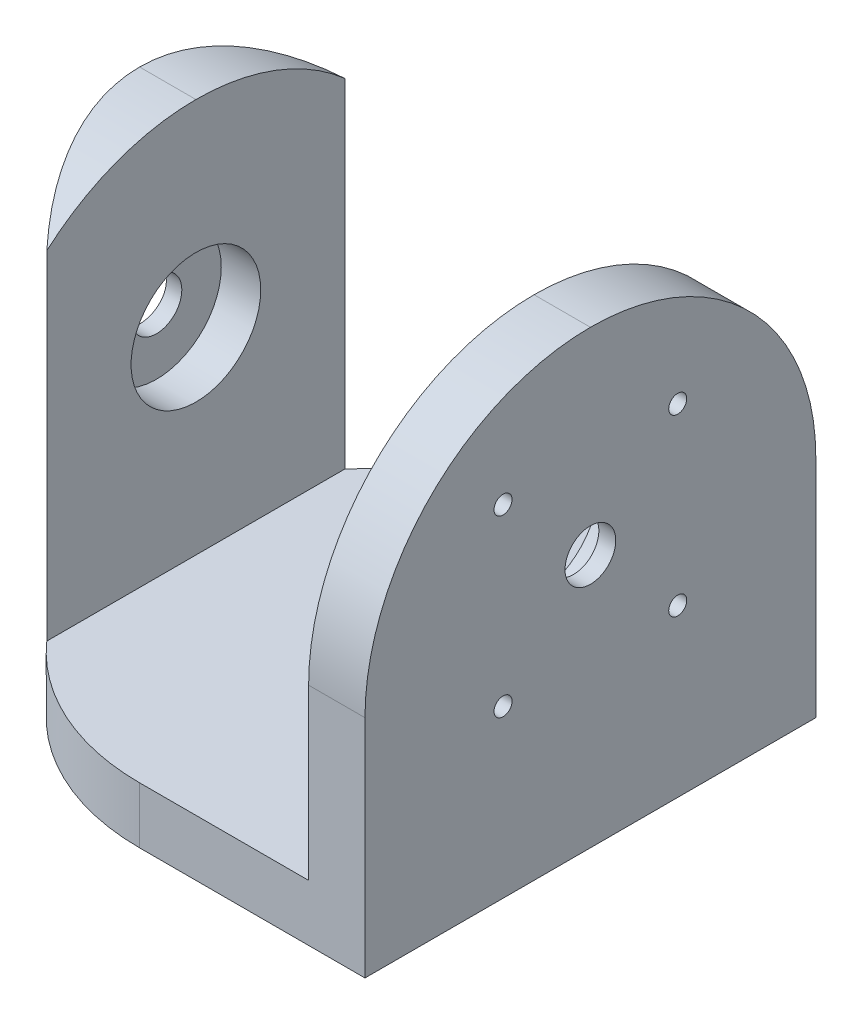
ISO-10303-21;
HEADER;
FILE_DESCRIPTION(('STEP AP214'),'2;1');
FILE_NAME('part.step','',(''),(''),'','','');
FILE_SCHEMA(('AUTOMOTIVE_DESIGN { 1 0 10303 214 1 1 1 1 }'));
ENDSEC;
DATA;
#1=APPLICATION_CONTEXT('core data for automotive mechanical design processes');
#2=APPLICATION_PROTOCOL_DEFINITION('international standard','automotive_design',2000,#1);
#3=PRODUCT_CONTEXT('',#1,'mechanical');
#4=PRODUCT('Part','Part','',(#3));
#5=PRODUCT_RELATED_PRODUCT_CATEGORY('part','',(#4));
#6=PRODUCT_DEFINITION_FORMATION('','',#4);
#7=PRODUCT_DEFINITION_CONTEXT('part definition',#1,'design');
#8=PRODUCT_DEFINITION('design','',#6,#7);
#9=PRODUCT_DEFINITION_SHAPE('','',#8);
#10=(LENGTH_UNIT() NAMED_UNIT(*) SI_UNIT(.MILLI.,.METRE.));
#11=(NAMED_UNIT(*) PLANE_ANGLE_UNIT() SI_UNIT($,.RADIAN.));
#12=(NAMED_UNIT(*) SI_UNIT($,.STERADIAN.) SOLID_ANGLE_UNIT());
#13=UNCERTAINTY_MEASURE_WITH_UNIT(LENGTH_MEASURE(1.E-05),#10,'distance_accuracy_value','');
#14=(GEOMETRIC_REPRESENTATION_CONTEXT(3) GLOBAL_UNCERTAINTY_ASSIGNED_CONTEXT((#13)) GLOBAL_UNIT_ASSIGNED_CONTEXT((#10,
#11,#12)) REPRESENTATION_CONTEXT('',''));
#15=CARTESIAN_POINT('',(0.,0.,0.));
#16=DIRECTION('',(0.,0.,1.));
#17=DIRECTION('',(1.,0.,0.));
#18=AXIS2_PLACEMENT_3D('',#15,#16,#17);
#19=CARTESIAN_POINT('',(0.,10.,0.));
#20=DIRECTION('',(0.,-1.,0.));
#21=DIRECTION('',(0.,0.,-1.));
#22=AXIS2_PLACEMENT_3D('',#19,#20,#21);
#23=PLANE('',#22);
#24=DIRECTION('',(-1.,0.,0.));
#25=VECTOR('',#24,1.);
#26=CARTESIAN_POINT('',(0.,10.,1.75));
#27=LINE('',#26,#25);
#28=CARTESIAN_POINT('',(2.28103594886183,10.,1.75));
#29=VERTEX_POINT('',#28);
#30=CARTESIAN_POINT('',(-2.28103594886183,10.,1.75));
#31=VERTEX_POINT('',#30);
#32=EDGE_CURVE('E361',#29,#31,#27,.T.);
#33=ORIENTED_EDGE('',*,*,#32,.T.);
#34=CARTESIAN_POINT('',(0.,10.,0.));
#35=DIRECTION('',(0.,1.,0.));
#36=DIRECTION('',(0.,0.,1.));
#37=AXIS2_PLACEMENT_3D('',#34,#35,#36);
#38=CIRCLE('',#37,2.875);
#39=EDGE_CURVE('E364',#29,#31,#38,.T.);
#40=ORIENTED_EDGE('',*,*,#39,.F.);
#41=EDGE_LOOP('',(#33,#40));
#42=FACE_BOUND('',#41,.T.);
#43=CARTESIAN_POINT('',(0.,9.99999999999999,0.));
#44=DIRECTION('',(0.,-1.,0.));
#45=DIRECTION('',(0.,0.,-1.));
#46=AXIS2_PLACEMENT_3D('',#43,#44,#45);
#47=CIRCLE('',#46,40.);
#48=CARTESIAN_POINT('',(-30.,9.99999999999999,-26.457513110646));
#49=VERTEX_POINT('',#48);
#50=CARTESIAN_POINT('',(0.,9.99999999999999,-40.));
#51=VERTEX_POINT('',#50);
#52=EDGE_CURVE('E312',#49,#51,#47,.T.);
#53=ORIENTED_EDGE('',*,*,#52,.F.);
#54=DIRECTION('',(0.,0.,1.));
#55=VECTOR('',#54,1.);
#56=CARTESIAN_POINT('',(-30.,10.,-40.));
#57=LINE('',#56,#55);
#58=CARTESIAN_POINT('',(-30.,9.99999999999999,26.4575131106459));
#59=VERTEX_POINT('',#58);
#60=EDGE_CURVE('E372',#49,#59,#57,.T.);
#61=ORIENTED_EDGE('',*,*,#60,.T.);
#62=CARTESIAN_POINT('',(0.,9.99999999999999,0.));
#63=DIRECTION('',(0.,-1.,0.));
#64=DIRECTION('',(0.,0.,-1.));
#65=AXIS2_PLACEMENT_3D('',#62,#63,#64);
#66=CIRCLE('',#65,40.);
#67=CARTESIAN_POINT('',(0.,9.99999999999999,40.));
#68=VERTEX_POINT('',#67);
#69=EDGE_CURVE('E332',#68,#59,#66,.T.);
#70=ORIENTED_EDGE('',*,*,#69,.F.);
#71=DIRECTION('',(1.,0.,0.));
#72=VECTOR('',#71,1.);
#73=CARTESIAN_POINT('',(-40.,10.,40.));
#74=LINE('',#73,#72);
#75=CARTESIAN_POINT('',(30.,10.,40.));
#76=VERTEX_POINT('',#75);
#77=EDGE_CURVE('E264',#68,#76,#74,.T.);
#78=ORIENTED_EDGE('',*,*,#77,.T.);
#79=DIRECTION('',(0.,0.,1.));
#80=VECTOR('',#79,1.);
#81=CARTESIAN_POINT('',(30.,10.,-40.));
#82=LINE('',#81,#80);
#83=CARTESIAN_POINT('',(30.,10.,-40.));
#84=VERTEX_POINT('',#83);
#85=EDGE_CURVE('E286',#84,#76,#82,.T.);
#86=ORIENTED_EDGE('',*,*,#85,.F.);
#87=DIRECTION('',(-1.,0.,0.));
#88=VECTOR('',#87,1.);
#89=CARTESIAN_POINT('',(-40.,10.,-40.));
#90=LINE('',#89,#88);
#91=EDGE_CURVE('E292',#84,#51,#90,.T.);
#92=ORIENTED_EDGE('',*,*,#91,.T.);
#93=EDGE_LOOP('',(#53,#61,#70,#78,#86,#92));
#94=FACE_BOUND('',#93,.T.);
#95=ADVANCED_FACE('F41',(#42,#94),#23,.F.);
#96=CARTESIAN_POINT('',(0.,0.,0.));
#97=DIRECTION('',(0.,-1.,0.));
#98=DIRECTION('',(0.,0.,-1.));
#99=AXIS2_PLACEMENT_3D('',#96,#97,#98);
#100=PLANE('',#99);
#101=CARTESIAN_POINT('',(0.,0.,0.));
#102=DIRECTION('',(0.,-1.,0.));
#103=DIRECTION('',(0.,0.,-1.));
#104=AXIS2_PLACEMENT_3D('',#101,#102,#103);
#105=CIRCLE('',#104,3.625);
#106=CARTESIAN_POINT('',(0.,0.,-3.625));
#107=VERTEX_POINT('',#106);
#108=EDGE_CURVE('E343',#107,#107,#105,.T.);
#109=ORIENTED_EDGE('',*,*,#108,.F.);
#110=EDGE_LOOP('',(#109));
#111=FACE_BOUND('',#110,.T.);
#112=CARTESIAN_POINT('',(0.,0.,0.));
#113=DIRECTION('',(0.,-1.,0.));
#114=DIRECTION('',(0.,0.,-1.));
#115=AXIS2_PLACEMENT_3D('',#112,#113,#114);
#116=CIRCLE('',#115,40.);
#117=CARTESIAN_POINT('',(0.,0.,40.));
#118=VERTEX_POINT('',#117);
#119=CARTESIAN_POINT('',(0.,0.,-40.));
#120=VERTEX_POINT('',#119);
#121=EDGE_CURVE('E310',#118,#120,#116,.T.);
#122=ORIENTED_EDGE('',*,*,#121,.T.);
#123=DIRECTION('',(-1.,0.,0.));
#124=VECTOR('',#123,1.);
#125=CARTESIAN_POINT('',(-40.,0.,-40.));
#126=LINE('',#125,#124);
#127=CARTESIAN_POINT('',(40.,0.,-40.));
#128=VERTEX_POINT('',#127);
#129=EDGE_CURVE('E303',#128,#120,#126,.T.);
#130=ORIENTED_EDGE('',*,*,#129,.F.);
#131=DIRECTION('',(0.,0.,-1.));
#132=VECTOR('',#131,1.);
#133=CARTESIAN_POINT('',(40.,0.,40.));
#134=LINE('',#133,#132);
#135=CARTESIAN_POINT('',(40.,0.,40.));
#136=VERTEX_POINT('',#135);
#137=EDGE_CURVE('E256',#136,#128,#134,.T.);
#138=ORIENTED_EDGE('',*,*,#137,.F.);
#139=DIRECTION('',(1.,0.,0.));
#140=VECTOR('',#139,1.);
#141=CARTESIAN_POINT('',(-40.,0.,40.));
#142=LINE('',#141,#140);
#143=EDGE_CURVE('E283',#118,#136,#142,.T.);
#144=ORIENTED_EDGE('',*,*,#143,.F.);
#145=EDGE_LOOP('',(#122,#130,#138,#144));
#146=FACE_BOUND('',#145,.T.);
#147=ADVANCED_FACE('F194',(#111,#146),#100,.T.);
#148=CARTESIAN_POINT('',(-30.,80.,-40.));
#149=DIRECTION('',(1.,0.,0.));
#150=DIRECTION('',(0.,0.,-1.));
#151=AXIS2_PLACEMENT_3D('',#148,#149,#150);
#152=PLANE('',#151);
#153=CARTESIAN_POINT('',(-30.,45.,0.));
#154=DIRECTION('',(1.,0.,0.));
#155=DIRECTION('',(0.,0.,-1.));
#156=AXIS2_PLACEMENT_3D('',#153,#154,#155);
#157=CIRCLE('',#156,11.5);
#158=CARTESIAN_POINT('',(-30.,45.,-11.5));
#159=VERTEX_POINT('',#158);
#160=EDGE_CURVE('E155',#159,#159,#157,.T.);
#161=ORIENTED_EDGE('',*,*,#160,.F.);
#162=EDGE_LOOP('',(#161));
#163=FACE_BOUND('',#162,.T.);
#164=ORIENTED_EDGE('',*,*,#60,.F.);
#165=DIRECTION('',(0.,-1.,0.));
#166=VECTOR('',#165,1.);
#167=CARTESIAN_POINT('',(-30.,80.,-26.457513110646));
#168=LINE('',#167,#166);
#169=CARTESIAN_POINT('',(-30.,70.,-26.4575131106459));
#170=VERTEX_POINT('',#169);
#171=EDGE_CURVE('E315',#49,#170,#168,.F.);
#172=ORIENTED_EDGE('',*,*,#171,.T.);
#173=CARTESIAN_POINT('',(-30.,40.,0.));
#174=DIRECTION('',(1.,0.,0.));
#175=DIRECTION('',(0.,0.,-1.));
#176=AXIS2_PLACEMENT_3D('',#173,#174,#175);
#177=CIRCLE('',#176,40.);
#178=CARTESIAN_POINT('',(-30.,80.,0.));
#179=VERTEX_POINT('',#178);
#180=EDGE_CURVE('E136',#170,#179,#177,.T.);
#181=ORIENTED_EDGE('',*,*,#180,.T.);
#182=CARTESIAN_POINT('',(-30.,40.,0.));
#183=DIRECTION('',(1.,0.,0.));
#184=DIRECTION('',(0.,0.,-1.));
#185=AXIS2_PLACEMENT_3D('',#182,#183,#184);
#186=CIRCLE('',#185,40.);
#187=CARTESIAN_POINT('',(-30.,70.,26.4575131106459));
#188=VERTEX_POINT('',#187);
#189=EDGE_CURVE('E153',#179,#188,#186,.T.);
#190=ORIENTED_EDGE('',*,*,#189,.T.);
#191=DIRECTION('',(0.,-1.,0.));
#192=VECTOR('',#191,1.);
#193=CARTESIAN_POINT('',(-30.,80.,26.4575131106459));
#194=LINE('',#193,#192);
#195=EDGE_CURVE('E146',#188,#59,#194,.T.);
#196=ORIENTED_EDGE('',*,*,#195,.T.);
#197=EDGE_LOOP('',(#164,#172,#181,#190,#196));
#198=FACE_BOUND('',#197,.T.);
#199=ADVANCED_FACE('F200',(#163,#198),#152,.T.);
#200=CARTESIAN_POINT('',(-37.,45.,0.));
#201=DIRECTION('',(-1.,0.,0.));
#202=DIRECTION('',(0.,0.,1.));
#203=AXIS2_PLACEMENT_3D('',#200,#201,#202);
#204=CYLINDRICAL_SURFACE('',#203,4.5);
#205=CARTESIAN_POINT('',(-37.,45.,0.));
#206=DIRECTION('',(1.,0.,0.));
#207=DIRECTION('',(0.,0.,-1.));
#208=AXIS2_PLACEMENT_3D('',#205,#206,#207);
#209=CIRCLE('',#208,4.5);
#210=CARTESIAN_POINT('',(-37.,45.,-4.5));
#211=VERTEX_POINT('',#210);
#212=EDGE_CURVE('E335',#211,#211,#209,.T.);
#213=ORIENTED_EDGE('',*,*,#212,.T.);
#214=EDGE_LOOP('',(#213));
#215=FACE_BOUND('',#214,.T.);
#216=CARTESIAN_POINT('',(-40.,40.5,0.));
#217=CARTESIAN_POINT('',(-39.9999998016922,40.5000006733647,0.125897794169932));
#218=CARTESIAN_POINT('',(-39.9994040479666,40.5052878583755,0.251816081917568));
#219=CARTESIAN_POINT('',(-39.997036799132,40.5264041517945,0.5028042246572));
#220=CARTESIAN_POINT('',(-39.995264739511,40.5422383217391,0.627873643147814));
#221=CARTESIAN_POINT('',(-39.9905906481609,40.5843710030467,0.876432829397886));
#222=CARTESIAN_POINT('',(-39.9876867415808,40.6106868784523,0.999919623230281));
#223=CARTESIAN_POINT('',(-39.9808298018973,40.6736009783238,1.24426437975462));
#224=CARTESIAN_POINT('',(-39.9768763726216,40.7102030859278,1.36512133105895));
#225=CARTESIAN_POINT('',(-39.9680387383215,40.7933593015609,1.60313538429751));
#226=CARTESIAN_POINT('',(-39.9631558476638,40.8398993673445,1.72029744174492));
#227=CARTESIAN_POINT('',(-39.9525909172002,40.9426447620923,1.95031817659451));
#228=CARTESIAN_POINT('',(-39.9469085828619,40.9988536549689,2.06317524837942));
#229=CARTESIAN_POINT('',(-39.9349103713499,41.1204738204987,2.28366274850285));
#230=CARTESIAN_POINT('',(-39.9285950056627,41.1858776805917,2.39129729390047));
#231=CARTESIAN_POINT('',(-39.9155011432103,41.325484938078,2.60072736280874));
#232=CARTESIAN_POINT('',(-39.9087224756033,41.3996915889862,2.70252070665515));
#233=CARTESIAN_POINT('',(-39.8948677682332,41.5566576619524,2.89988809192034));
#234=CARTESIAN_POINT('',(-39.8877907110016,41.6394480370957,2.99543744607898));
#235=CARTESIAN_POINT('',(-39.8735598649228,41.8128007692536,3.17926532476615));
#236=CARTESIAN_POINT('',(-39.8664060486691,41.9033659889012,3.26754114759346));
#237=CARTESIAN_POINT('',(-39.8522281504109,42.0915829299084,3.43614153534427));
#238=CARTESIAN_POINT('',(-39.8452040338624,42.1892327291964,3.51646824301364));
#239=CARTESIAN_POINT('',(-39.8314796721273,42.3909954690487,3.66866040017973));
#240=CARTESIAN_POINT('',(-39.8247795474037,42.4951107811752,3.74052271658939));
#241=CARTESIAN_POINT('',(-39.8118812330373,42.7092932908895,3.87539874952149));
#242=CARTESIAN_POINT('',(-39.8056842460055,42.8193737575812,3.93839151503679));
#243=CARTESIAN_POINT('',(-39.7939848415169,43.0445267701195,4.05489824320788));
#244=CARTESIAN_POINT('',(-39.7884826825745,43.1596011527077,4.10840868088398));
#245=CARTESIAN_POINT('',(-39.7783363482945,43.3938512076461,4.20551394183275));
#246=CARTESIAN_POINT('',(-39.773691825973,43.5130251981181,4.2491127768143));
#247=CARTESIAN_POINT('',(-39.765389602351,43.7546727516294,4.3261146559858));
#248=CARTESIAN_POINT('',(-39.7617322689817,43.8771475262375,4.35951389933416));
#249=CARTESIAN_POINT('',(-39.7524421143434,44.2470529143269,4.44372607448188));
#250=CARTESIAN_POINT('',(-39.7484346980064,44.4982284798943,4.4790755474873));
#251=CARTESIAN_POINT('',(-39.7452681870008,45.0029747377956,4.5070916983492));
#252=CARTESIAN_POINT('',(-39.7461089415873,45.256545355415,4.49975970330635));
#253=CARTESIAN_POINT('',(-39.7509021396873,45.6324515075959,4.45711639306198));
#254=CARTESIAN_POINT('',(-39.7530815508767,45.7567945774525,4.43769026744366));
#255=CARTESIAN_POINT('',(-39.758541588758,46.0033799405732,4.38850855674904));
#256=CARTESIAN_POINT('',(-39.7618218034796,46.1256230017909,4.35875683583387));
#257=CARTESIAN_POINT('',(-39.7693932267524,46.367199519133,4.28912359161516));
#258=CARTESIAN_POINT('',(-39.7736848277801,46.4865318258281,4.24923813536442));
#259=CARTESIAN_POINT('',(-39.783154101944,46.7213678752207,4.15964880119058));
#260=CARTESIAN_POINT('',(-39.788331453898,46.8368729876386,4.10994848123141));
#261=CARTESIAN_POINT('',(-39.7994416250633,47.0635915711467,4.00093163997066));
#262=CARTESIAN_POINT('',(-39.8053764094869,47.1747928610676,3.94158999012488));
#263=CARTESIAN_POINT('',(-39.8178202640958,47.3917647613468,3.81383079042048));
#264=CARTESIAN_POINT('',(-39.8243291253585,47.497537325381,3.74541653780618));
#265=CARTESIAN_POINT('',(-39.8377416223662,47.7029930052001,3.59995508535281));
#266=CARTESIAN_POINT('',(-39.8446453816279,47.8026741953291,3.52290517713157));
#267=CARTESIAN_POINT('',(-39.8586492001324,47.9951846495661,3.36075902274504));
#268=CARTESIAN_POINT('',(-39.8657491872425,48.0880163866485,3.27566570619095));
#269=CARTESIAN_POINT('',(-39.8799900295372,48.2667395897394,3.09748712474335));
#270=CARTESIAN_POINT('',(-39.8871308839011,48.3525878709552,3.00435853662628));
#271=CARTESIAN_POINT('',(-39.9012077856988,48.516108341074,2.81122504105011));
#272=CARTESIAN_POINT('',(-39.9081439071697,48.5937835123227,2.71122266399387));
#273=CARTESIAN_POINT('',(-39.9216237223485,48.7405058049993,2.50492536120184));
#274=CARTESIAN_POINT('',(-39.9281670838737,48.809545675015,2.39862525592465));
#275=CARTESIAN_POINT('',(-39.9406674482757,48.9384043456287,2.18059634604119));
#276=CARTESIAN_POINT('',(-39.9466246692907,48.9982265813938,2.0688695843211));
#277=CARTESIAN_POINT('',(-39.9577948244914,49.1083296942292,1.84057351974979));
#278=CARTESIAN_POINT('',(-39.9630066685784,49.1585966315048,1.72399743986509));
#279=CARTESIAN_POINT('',(-39.9725255898458,49.2490973113226,1.48702771834148));
#280=CARTESIAN_POINT('',(-39.9768330112379,49.289334872012,1.36663554920902));
#281=CARTESIAN_POINT('',(-39.9844163789569,49.3594456186983,1.12306243727675));
#282=CARTESIAN_POINT('',(-39.9876940604375,49.3893362484458,0.999886564756));
#283=CARTESIAN_POINT('',(-39.9931331545323,49.4386149287772,0.751478051908749));
#284=CARTESIAN_POINT('',(-39.9952951105742,49.4580080925054,0.626246443580106));
#285=CARTESIAN_POINT('',(-39.9979088348612,49.4813826283866,0.417372166218101));
#286=CARTESIAN_POINT('',(-39.9986920958534,49.4883617060622,0.334057162753994));
#287=CARTESIAN_POINT('',(-39.999737744327,49.4976706160565,0.167164450744655));
#288=CARTESIAN_POINT('',(-40.0000001316616,49.5000004470639,0.0835867421253376));
#289=CARTESIAN_POINT('',(-39.9999998016922,49.4999993266353,-0.125897794169917));
#290=CARTESIAN_POINT('',(-39.9994040479666,49.4947121416245,-0.251816081917552));
#291=CARTESIAN_POINT('',(-39.997036799132,49.4735958482055,-0.502804224657184));
#292=CARTESIAN_POINT('',(-39.995264739511,49.4577616782609,-0.627873643147799));
#293=CARTESIAN_POINT('',(-39.9905906481609,49.4156289969533,-0.87643282939787));
#294=CARTESIAN_POINT('',(-39.9876867415808,49.3893131215477,-0.999919623230264));
#295=CARTESIAN_POINT('',(-39.9808298018973,49.3263990216762,-1.2442643797546));
#296=CARTESIAN_POINT('',(-39.9768763726216,49.2897969140722,-1.36512133105894));
#297=CARTESIAN_POINT('',(-39.9680387383215,49.2066406984391,-1.60313538429749));
#298=CARTESIAN_POINT('',(-39.9631558476638,49.1601006326555,-1.7202974417449));
#299=CARTESIAN_POINT('',(-39.9525909172002,49.0573552379077,-1.9503181765945));
#300=CARTESIAN_POINT('',(-39.9469085828619,49.0011463450312,-2.06317524837941));
#301=CARTESIAN_POINT('',(-39.9349103713499,48.8795261795014,-2.28366274850284));
#302=CARTESIAN_POINT('',(-39.9285950056627,48.8141223194083,-2.39129729390046));
#303=CARTESIAN_POINT('',(-39.9155011432103,48.674515061922,-2.60072736280872));
#304=CARTESIAN_POINT('',(-39.9087224756033,48.6003084110138,-2.70252070665513));
#305=CARTESIAN_POINT('',(-39.8948677682332,48.4433423380476,-2.89988809192033));
#306=CARTESIAN_POINT('',(-39.8877907110016,48.3605519629043,-2.99543744607897));
#307=CARTESIAN_POINT('',(-39.8735598649228,48.1871992307465,-3.17926532476614));
#308=CARTESIAN_POINT('',(-39.8664060486691,48.0966340110988,-3.26754114759345));
#309=CARTESIAN_POINT('',(-39.8522281504109,47.9084170700916,-3.43614153534426));
#310=CARTESIAN_POINT('',(-39.8452040338624,47.8107672708036,-3.51646824301363));
#311=CARTESIAN_POINT('',(-39.8314796721273,47.6090045309513,-3.66866040017973));
#312=CARTESIAN_POINT('',(-39.8247795474037,47.5048892188248,-3.74052271658938));
#313=CARTESIAN_POINT('',(-39.8118812330373,47.2907067091105,-3.87539874952148));
#314=CARTESIAN_POINT('',(-39.8056842460055,47.1806262424189,-3.93839151503678));
#315=CARTESIAN_POINT('',(-39.7939848415169,46.9554732298805,-4.05489824320787));
#316=CARTESIAN_POINT('',(-39.7884826825745,46.8403988472923,-4.10840868088398));
#317=CARTESIAN_POINT('',(-39.7783363482945,46.6061487923539,-4.20551394183274));
#318=CARTESIAN_POINT('',(-39.773691825973,46.4869748018819,-4.2491127768143));
#319=CARTESIAN_POINT('',(-39.765389602351,46.2453272483707,-4.3261146559858));
#320=CARTESIAN_POINT('',(-39.7617322689817,46.1228524737625,-4.35951389933416));
#321=CARTESIAN_POINT('',(-39.7524421143434,45.7529470856731,-4.44372607448188));
#322=CARTESIAN_POINT('',(-39.7484346980064,45.5017715201057,-4.4790755474873));
#323=CARTESIAN_POINT('',(-39.7452681870008,44.9970252622045,-4.5070916983492));
#324=CARTESIAN_POINT('',(-39.7461089415873,44.743454644585,-4.49975970330635));
#325=CARTESIAN_POINT('',(-39.7509021396873,44.3675484924041,-4.45711639306199));
#326=CARTESIAN_POINT('',(-39.7530815508767,44.2432054225476,-4.43769026744367));
#327=CARTESIAN_POINT('',(-39.758541588758,43.9966200594269,-4.38850855674904));
#328=CARTESIAN_POINT('',(-39.7618218034796,43.8743769982091,-4.35875683583388));
#329=CARTESIAN_POINT('',(-39.7693932267524,43.632800480867,-4.28912359161517));
#330=CARTESIAN_POINT('',(-39.7736848277801,43.5134681741719,-4.24923813536443));
#331=CARTESIAN_POINT('',(-39.783154101944,43.2786321247793,-4.1596488011906));
#332=CARTESIAN_POINT('',(-39.788331453898,43.1631270123615,-4.10994848123143));
#333=CARTESIAN_POINT('',(-39.7994416250633,42.9364084288534,-4.00093163997067));
#334=CARTESIAN_POINT('',(-39.8053764094869,42.8252071389324,-3.94158999012489));
#335=CARTESIAN_POINT('',(-39.8178202640958,42.6082352386532,-3.8138307904205));
#336=CARTESIAN_POINT('',(-39.8243291253585,42.502462674619,-3.7454165378062));
#337=CARTESIAN_POINT('',(-39.8377416223662,42.2970069947999,-3.59995508535283));
#338=CARTESIAN_POINT('',(-39.8446453816279,42.1973258046709,-3.52290517713159));
#339=CARTESIAN_POINT('',(-39.8586492001324,42.0048153504339,-3.36075902274505));
#340=CARTESIAN_POINT('',(-39.8657491872425,41.9119836133515,-3.27566570619097));
#341=CARTESIAN_POINT('',(-39.8799900295372,41.7332604102607,-3.09748712474337));
#342=CARTESIAN_POINT('',(-39.8871308839011,41.6474121290448,-3.0043585366263));
#343=CARTESIAN_POINT('',(-39.9012077856988,41.4838916589261,-2.81122504105013));
#344=CARTESIAN_POINT('',(-39.9081439071697,41.4062164876773,-2.71122266399389));
#345=CARTESIAN_POINT('',(-39.9216237223485,41.2594941950007,-2.50492536120186));
#346=CARTESIAN_POINT('',(-39.9281670838737,41.190454324985,-2.39862525592467));
#347=CARTESIAN_POINT('',(-39.9406674482757,41.0615956543713,-2.18059634604121));
#348=CARTESIAN_POINT('',(-39.9466246692907,41.0017734186062,-2.06886958432112));
#349=CARTESIAN_POINT('',(-39.9577948244914,40.8916703057708,-1.84057351974982));
#350=CARTESIAN_POINT('',(-39.9630066685784,40.8414033684952,-1.72399743986511));
#351=CARTESIAN_POINT('',(-39.9725255898458,40.7509026886774,-1.4870277183415));
#352=CARTESIAN_POINT('',(-39.9768330112379,40.710665127988,-1.36663554920905));
#353=CARTESIAN_POINT('',(-39.9844163789569,40.6405543813017,-1.12306243727678));
#354=CARTESIAN_POINT('',(-39.9876940604375,40.6106637515542,-0.999886564756024));
#355=CARTESIAN_POINT('',(-39.9931331545323,40.5613850712228,-0.751478051908773));
#356=CARTESIAN_POINT('',(-39.9952951105742,40.5419919074946,-0.626246443580131));
#357=CARTESIAN_POINT('',(-39.9979088348612,40.5186173716134,-0.417372166218122));
#358=CARTESIAN_POINT('',(-39.9986920958534,40.5116382939378,-0.334057162754008));
#359=CARTESIAN_POINT('',(-39.999737744327,40.5023293839435,-0.167164450744654));
#360=CARTESIAN_POINT('',(-40.0000001316616,40.4999995529361,-0.0835867421253299));
#361=CARTESIAN_POINT('',(-40.,40.5,0.));
#362=B_SPLINE_CURVE_WITH_KNOTS('',3,(#216,#217,#218,#219,#220,#221,#222,#223,#224,#225,#226,
#227,#228,#229,#230,#231,#232,#233,#234,#235,#236,#237,#238,#239,#240,#241,#242,#243,#244,#245,
#246,#247,#248,#249,#250,#251,#252,#253,#254,#255,#256,#257,#258,#259,#260,#261,#262,#263,#264,
#265,#266,#267,#268,#269,#270,#271,#272,#273,#274,#275,#276,#277,#278,#279,#280,#281,#282,#283,
#284,#285,#286,#287,#288,#289,#290,#291,#292,#293,#294,#295,#296,#297,#298,#299,#300,#301,#302,
#303,#304,#305,#306,#307,#308,#309,#310,#311,#312,#313,#314,#315,#316,#317,#318,#319,#320,#321,
#322,#323,#324,#325,#326,#327,#328,#329,#330,#331,#332,#333,#334,#335,#336,#337,#338,#339,#340,
#341,#342,#343,#344,#345,#346,#347,#348,#349,#350,#351,#352,#353,#354,#355,#356,#357,#358,#359,
#360,#361),.UNSPECIFIED.,.T.,.F.,(4,2,2,2,2,2,2,2,2,2,2,2,2,2,2,2,2,2,2,2,2,2,2,2,2,2,2,2,2,2,2,
2,2,2,2,2,2,2,2,2,2,2,2,2,2,2,2,2,2,2,2,2,2,2,2,2,2,2,2,2,2,2,2,2,2,2,2,2,2,2,2,2,4),(0.,
0.37761673646876,0.755414823277612,1.13384139271567,1.51241101367371,1.89044921753152,
2.26862706535891,2.64650177336073,3.02451658172423,3.40394534007983,3.78351440508457,
4.16298087398963,4.54258736359209,4.92307600635537,5.30370579736136,5.68418125355195,
6.06479832004327,6.8219793799544,7.57913689685791,7.95637534198589,8.33347276463008,
8.71071676459905,9.08782426090975,9.46593087561174,9.8439004501884,10.2219889000304,
10.599940167334,10.98007451503,11.3600696681502,11.7403818062749,12.120551867583,
12.5012723555682,12.881847682512,13.2617782416617,13.6415235759312,13.8922328443466,
14.1429421834699,14.5205589199387,14.8983570067475,15.2767835761856,15.6553531971436,
16.0333914010014,16.4115692488288,16.7894439568306,17.1674587651941,17.5468875235497,
17.9264565885545,18.3059230574595,18.685529547062,19.0660181898253,19.4466479808313,
19.8271234370218,20.2077405035132,20.9649215634243,21.7220790803278,22.0993175254558,
22.4764149481,22.853658948069,23.2307664443797,23.6088730590816,23.9868426336583,
24.3649310835003,24.7428823508039,25.1230166984998,25.5030118516201,25.8833239897448,
26.2634940510529,26.6442145390381,27.0247898659819,27.4047204251317,27.7844657594011,
28.0351750278165,28.2858843669399),.UNSPECIFIED.);
#363=CARTESIAN_POINT('',(-40.,40.5,0.));
#364=VERTEX_POINT('',#363);
#365=EDGE_CURVE('E50',#364,#364,#362,.T.);
#366=ORIENTED_EDGE('',*,*,#365,.T.);
#367=EDGE_LOOP('',(#366));
#368=FACE_BOUND('',#367,.T.);
#369=ADVANCED_FACE('F175',(#215,#368),#204,.F.);
#370=CARTESIAN_POINT('',(-40.,10.,-40.));
#371=DIRECTION('',(0.,0.,1.));
#372=DIRECTION('',(1.,0.,0.));
#373=AXIS2_PLACEMENT_3D('',#370,#371,#372);
#374=PLANE('',#373);
#375=DIRECTION('',(0.,-1.,0.));
#376=VECTOR('',#375,1.);
#377=CARTESIAN_POINT('',(0.,80.,-40.));
#378=LINE('',#377,#376);
#379=EDGE_CURVE('E297',#51,#120,#378,.T.);
#380=ORIENTED_EDGE('',*,*,#379,.F.);
#381=ORIENTED_EDGE('',*,*,#91,.F.);
#382=DIRECTION('',(0.,-1.,0.));
#383=VECTOR('',#382,1.);
#384=CARTESIAN_POINT('',(30.,80.,-40.));
#385=LINE('',#384,#383);
#386=CARTESIAN_POINT('',(30.,40.,-40.));
#387=VERTEX_POINT('',#386);
#388=EDGE_CURVE('E249',#387,#84,#385,.T.);
#389=ORIENTED_EDGE('',*,*,#388,.F.);
#390=DIRECTION('',(-1.,0.,0.));
#391=VECTOR('',#390,1.);
#392=CARTESIAN_POINT('',(-40.,40.,-40.));
#393=LINE('',#392,#391);
#394=CARTESIAN_POINT('',(40.,40.,-40.));
#395=VERTEX_POINT('',#394);
#396=EDGE_CURVE('E240',#387,#395,#393,.F.);
#397=ORIENTED_EDGE('',*,*,#396,.T.);
#398=DIRECTION('',(0.,-1.,0.));
#399=VECTOR('',#398,1.);
#400=CARTESIAN_POINT('',(40.,10.,-40.));
#401=LINE('',#400,#399);
#402=EDGE_CURVE('E246',#395,#128,#401,.T.);
#403=ORIENTED_EDGE('',*,*,#402,.T.);
#404=ORIENTED_EDGE('',*,*,#129,.T.);
#405=EDGE_LOOP('',(#380,#381,#389,#397,#403,#404));
#406=FACE_BOUND('',#405,.T.);
#407=ADVANCED_FACE('F214',(#406),#374,.F.);
#408=CARTESIAN_POINT('',(-40.,40.,0.));
#409=DIRECTION('',(1.,0.,0.));
#410=DIRECTION('',(0.,0.,-1.));
#411=AXIS2_PLACEMENT_3D('',#408,#409,#410);
#412=CYLINDRICAL_SURFACE('',#411,40.);
#413=ORIENTED_EDGE('',*,*,#180,.F.);
#414=CARTESIAN_POINT('',(0.,40.,0.));
#415=DIRECTION('',(0.707106781186547,0.707106781186547,0.));
#416=DIRECTION('',(0.707106781186547,-0.707106781186547,0.));
#417=AXIS2_PLACEMENT_3D('',#414,#415,#416);
#418=ELLIPSE('',#417,56.5685424949238,40.);
#419=CARTESIAN_POINT('',(-40.,80.,0.));
#420=VERTEX_POINT('',#419);
#421=EDGE_CURVE('E11',#170,#420,#418,.T.);
#422=ORIENTED_EDGE('',*,*,#421,.T.);
#423=DIRECTION('',(1.,0.,0.));
#424=VECTOR('',#423,1.);
#425=CARTESIAN_POINT('',(0.,80.,0.));
#426=LINE('',#425,#424);
#427=EDGE_CURVE('E134',#179,#420,#426,.F.);
#428=ORIENTED_EDGE('',*,*,#427,.F.);
#429=EDGE_LOOP('',(#413,#422,#428));
#430=FACE_BOUND('',#429,.T.);
#431=ADVANCED_FACE('F132',(#430),#412,.T.);
#432=CARTESIAN_POINT('',(-40.,40.,0.));
#433=DIRECTION('',(-1.,0.,0.));
#434=DIRECTION('',(0.,0.,1.));
#435=AXIS2_PLACEMENT_3D('',#432,#433,#434);
#436=CYLINDRICAL_SURFACE('',#435,40.);
#437=ORIENTED_EDGE('',*,*,#427,.T.);
#438=CARTESIAN_POINT('',(0.,40.,0.));
#439=DIRECTION('',(-0.707106781186547,-0.707106781186547,0.));
#440=DIRECTION('',(-0.707106781186547,0.707106781186547,0.));
#441=AXIS2_PLACEMENT_3D('',#438,#439,#440);
#442=ELLIPSE('',#441,56.5685424949238,40.);
#443=EDGE_CURVE('E140',#420,#188,#442,.F.);
#444=ORIENTED_EDGE('',*,*,#443,.T.);
#445=ORIENTED_EDGE('',*,*,#189,.F.);
#446=EDGE_LOOP('',(#437,#444,#445));
#447=FACE_BOUND('',#446,.T.);
#448=ADVANCED_FACE('F152',(#447),#436,.T.);
#449=CARTESIAN_POINT('',(40.,10.,40.));
#450=DIRECTION('',(-1.,0.,0.));
#451=DIRECTION('',(0.,0.,1.));
#452=AXIS2_PLACEMENT_3D('',#449,#450,#451);
#453=PLANE('',#452);
#454=CARTESIAN_POINT('',(40.,60.5,-15.5));
#455=DIRECTION('',(-1.,0.,0.));
#456=DIRECTION('',(0.,0.,1.));
#457=AXIS2_PLACEMENT_3D('',#454,#455,#456);
#458=CIRCLE('',#457,1.6);
#459=CARTESIAN_POINT('',(40.,60.5,-13.9));
#460=VERTEX_POINT('',#459);
#461=EDGE_CURVE('E386',#460,#460,#458,.T.);
#462=ORIENTED_EDGE('',*,*,#461,.T.);
#463=EDGE_LOOP('',(#462));
#464=FACE_BOUND('',#463,.T.);
#465=CARTESIAN_POINT('',(40.,60.5,15.5));
#466=DIRECTION('',(-1.,0.,0.));
#467=DIRECTION('',(0.,0.,1.));
#468=AXIS2_PLACEMENT_3D('',#465,#466,#467);
#469=CIRCLE('',#468,1.6);
#470=CARTESIAN_POINT('',(40.,60.5,17.1));
#471=VERTEX_POINT('',#470);
#472=EDGE_CURVE('E398',#471,#471,#469,.T.);
#473=ORIENTED_EDGE('',*,*,#472,.T.);
#474=EDGE_LOOP('',(#473));
#475=FACE_BOUND('',#474,.T.);
#476=CARTESIAN_POINT('',(40.,29.5,15.5));
#477=DIRECTION('',(-1.,0.,0.));
#478=DIRECTION('',(0.,0.,1.));
#479=AXIS2_PLACEMENT_3D('',#476,#477,#478);
#480=CIRCLE('',#479,1.6);
#481=CARTESIAN_POINT('',(40.,29.5,17.1));
#482=VERTEX_POINT('',#481);
#483=EDGE_CURVE('E410',#482,#482,#480,.T.);
#484=ORIENTED_EDGE('',*,*,#483,.T.);
#485=EDGE_LOOP('',(#484));
#486=FACE_BOUND('',#485,.T.);
#487=CARTESIAN_POINT('',(40.,29.5,-15.5));
#488=DIRECTION('',(-1.,0.,0.));
#489=DIRECTION('',(0.,0.,1.));
#490=AXIS2_PLACEMENT_3D('',#487,#488,#489);
#491=CIRCLE('',#490,1.6);
#492=CARTESIAN_POINT('',(40.,29.5,-13.9));
#493=VERTEX_POINT('',#492);
#494=EDGE_CURVE('E295',#493,#493,#491,.T.);
#495=ORIENTED_EDGE('',*,*,#494,.T.);
#496=EDGE_LOOP('',(#495));
#497=FACE_BOUND('',#496,.T.);
#498=ORIENTED_EDGE('',*,*,#402,.F.);
#499=CARTESIAN_POINT('',(40.,40.,0.));
#500=DIRECTION('',(-1.,0.,0.));
#501=DIRECTION('',(0.,0.,1.));
#502=AXIS2_PLACEMENT_3D('',#499,#500,#501);
#503=CIRCLE('',#502,40.);
#504=CARTESIAN_POINT('',(40.,80.,0.));
#505=VERTEX_POINT('',#504);
#506=EDGE_CURVE('E57',#395,#505,#503,.F.);
#507=ORIENTED_EDGE('',*,*,#506,.T.);
#508=CARTESIAN_POINT('',(40.,40.,0.));
#509=DIRECTION('',(-1.,0.,0.));
#510=DIRECTION('',(0.,0.,1.));
#511=AXIS2_PLACEMENT_3D('',#508,#509,#510);
#512=CIRCLE('',#511,40.);
#513=CARTESIAN_POINT('',(40.,40.,40.));
#514=VERTEX_POINT('',#513);
#515=EDGE_CURVE('E242',#505,#514,#512,.F.);
#516=ORIENTED_EDGE('',*,*,#515,.T.);
#517=DIRECTION('',(0.,-1.,0.));
#518=VECTOR('',#517,1.);
#519=CARTESIAN_POINT('',(40.,10.,40.));
#520=LINE('',#519,#518);
#521=EDGE_CURVE('E259',#514,#136,#520,.T.);
#522=ORIENTED_EDGE('',*,*,#521,.T.);
#523=ORIENTED_EDGE('',*,*,#137,.T.);
#524=EDGE_LOOP('',(#498,#507,#516,#522,#523));
#525=FACE_BOUND('',#524,.T.);
#526=CARTESIAN_POINT('',(40.,45.,0.));
#527=DIRECTION('',(-1.,0.,0.));
#528=DIRECTION('',(0.,0.,1.));
#529=AXIS2_PLACEMENT_3D('',#526,#527,#528);
#530=CIRCLE('',#529,4.5);
#531=CARTESIAN_POINT('',(40.,45.,4.49999999999998));
#532=VERTEX_POINT('',#531);
#533=EDGE_CURVE('E727',#532,#532,#530,.T.);
#534=ORIENTED_EDGE('',*,*,#533,.T.);
#535=EDGE_LOOP('',(#534));
#536=FACE_BOUND('',#535,.T.);
#537=ADVANCED_FACE('F212',(#464,#475,#486,#497,#525,#536),#453,.F.);
#538=CARTESIAN_POINT('',(-40.,10.,40.));
#539=DIRECTION('',(0.,0.,-1.));
#540=DIRECTION('',(-1.,0.,0.));
#541=AXIS2_PLACEMENT_3D('',#538,#539,#540);
#542=PLANE('',#541);
#543=ORIENTED_EDGE('',*,*,#77,.F.);
#544=DIRECTION('',(0.,-1.,0.));
#545=VECTOR('',#544,1.);
#546=CARTESIAN_POINT('',(0.,80.,40.));
#547=LINE('',#546,#545);
#548=EDGE_CURVE('E150',#68,#118,#547,.T.);
#549=ORIENTED_EDGE('',*,*,#548,.T.);
#550=ORIENTED_EDGE('',*,*,#143,.T.);
#551=ORIENTED_EDGE('',*,*,#521,.F.);
#552=DIRECTION('',(1.,0.,0.));
#553=VECTOR('',#552,1.);
#554=CARTESIAN_POINT('',(-40.,40.,40.));
#555=LINE('',#554,#553);
#556=CARTESIAN_POINT('',(30.,40.,40.));
#557=VERTEX_POINT('',#556);
#558=EDGE_CURVE('E258',#514,#557,#555,.F.);
#559=ORIENTED_EDGE('',*,*,#558,.T.);
#560=DIRECTION('',(0.,-1.,0.));
#561=VECTOR('',#560,1.);
#562=CARTESIAN_POINT('',(30.,80.,40.));
#563=LINE('',#562,#561);
#564=EDGE_CURVE('E288',#557,#76,#563,.T.);
#565=ORIENTED_EDGE('',*,*,#564,.T.);
#566=EDGE_LOOP('',(#543,#549,#550,#551,#559,#565));
#567=FACE_BOUND('',#566,.T.);
#568=ADVANCED_FACE('F209',(#567),#542,.F.);
#569=CARTESIAN_POINT('',(30.,80.,-40.));
#570=DIRECTION('',(1.,0.,0.));
#571=DIRECTION('',(0.,0.,-1.));
#572=AXIS2_PLACEMENT_3D('',#569,#570,#571);
#573=PLANE('',#572);
#574=CARTESIAN_POINT('',(30.,45.,0.));
#575=DIRECTION('',(1.,0.,0.));
#576=DIRECTION('',(0.,0.,-1.));
#577=AXIS2_PLACEMENT_3D('',#574,#575,#576);
#578=CIRCLE('',#577,11.5);
#579=CARTESIAN_POINT('',(30.,45.,-11.5));
#580=VERTEX_POINT('',#579);
#581=EDGE_CURVE('E161',#580,#580,#578,.T.);
#582=ORIENTED_EDGE('',*,*,#581,.T.);
#583=EDGE_LOOP('',(#582));
#584=FACE_BOUND('',#583,.T.);
#585=CARTESIAN_POINT('',(30.,60.5,-15.5));
#586=DIRECTION('',(-1.,0.,0.));
#587=DIRECTION('',(0.,0.,1.));
#588=AXIS2_PLACEMENT_3D('',#585,#586,#587);
#589=CIRCLE('',#588,3.15);
#590=CARTESIAN_POINT('',(30.,60.5,-12.35));
#591=VERTEX_POINT('',#590);
#592=EDGE_CURVE('E378',#591,#591,#589,.T.);
#593=ORIENTED_EDGE('',*,*,#592,.F.);
#594=EDGE_LOOP('',(#593));
#595=FACE_BOUND('',#594,.T.);
#596=CARTESIAN_POINT('',(30.,60.5,15.5));
#597=DIRECTION('',(-1.,0.,0.));
#598=DIRECTION('',(0.,0.,1.));
#599=AXIS2_PLACEMENT_3D('',#596,#597,#598);
#600=CIRCLE('',#599,3.15);
#601=CARTESIAN_POINT('',(30.,60.5,18.65));
#602=VERTEX_POINT('',#601);
#603=EDGE_CURVE('E390',#602,#602,#600,.T.);
#604=ORIENTED_EDGE('',*,*,#603,.F.);
#605=EDGE_LOOP('',(#604));
#606=FACE_BOUND('',#605,.T.);
#607=CARTESIAN_POINT('',(30.,29.5,15.5));
#608=DIRECTION('',(-1.,0.,0.));
#609=DIRECTION('',(0.,0.,1.));
#610=AXIS2_PLACEMENT_3D('',#607,#608,#609);
#611=CIRCLE('',#610,3.15);
#612=CARTESIAN_POINT('',(30.,29.5,18.65));
#613=VERTEX_POINT('',#612);
#614=EDGE_CURVE('E402',#613,#613,#611,.T.);
#615=ORIENTED_EDGE('',*,*,#614,.F.);
#616=EDGE_LOOP('',(#615));
#617=FACE_BOUND('',#616,.T.);
#618=CARTESIAN_POINT('',(30.,29.5,-15.5));
#619=DIRECTION('',(-1.,0.,0.));
#620=DIRECTION('',(0.,0.,1.));
#621=AXIS2_PLACEMENT_3D('',#618,#619,#620);
#622=CIRCLE('',#621,3.15);
#623=CARTESIAN_POINT('',(30.,29.5,-12.35));
#624=VERTEX_POINT('',#623);
#625=EDGE_CURVE('E414',#624,#624,#622,.T.);
#626=ORIENTED_EDGE('',*,*,#625,.F.);
#627=EDGE_LOOP('',(#626));
#628=FACE_BOUND('',#627,.T.);
#629=CARTESIAN_POINT('',(30.,40.,0.));
#630=DIRECTION('',(1.,0.,0.));
#631=DIRECTION('',(0.,0.,-1.));
#632=AXIS2_PLACEMENT_3D('',#629,#630,#631);
#633=CIRCLE('',#632,40.);
#634=CARTESIAN_POINT('',(30.,80.,0.));
#635=VERTEX_POINT('',#634);
#636=EDGE_CURVE('E65',#557,#635,#633,.F.);
#637=ORIENTED_EDGE('',*,*,#636,.T.);
#638=CARTESIAN_POINT('',(30.,40.,0.));
#639=DIRECTION('',(1.,0.,0.));
#640=DIRECTION('',(0.,0.,-1.));
#641=AXIS2_PLACEMENT_3D('',#638,#639,#640);
#642=CIRCLE('',#641,40.);
#643=EDGE_CURVE('E274',#635,#387,#642,.F.);
#644=ORIENTED_EDGE('',*,*,#643,.T.);
#645=ORIENTED_EDGE('',*,*,#388,.T.);
#646=ORIENTED_EDGE('',*,*,#85,.T.);
#647=ORIENTED_EDGE('',*,*,#564,.F.);
#648=EDGE_LOOP('',(#637,#644,#645,#646,#647));
#649=FACE_BOUND('',#648,.T.);
#650=ADVANCED_FACE('F206',(#584,#595,#606,#617,#628,#649),#573,.F.);
#651=CARTESIAN_POINT('',(30.,29.5,-15.5));
#652=DIRECTION('',(-1.,0.,0.));
#653=DIRECTION('',(0.,0.,1.));
#654=AXIS2_PLACEMENT_3D('',#651,#652,#653);
#655=CYLINDRICAL_SURFACE('',#654,1.6);
#656=ORIENTED_EDGE('',*,*,#494,.F.);
#657=EDGE_LOOP('',(#656));
#658=FACE_BOUND('',#657,.T.);
#659=CARTESIAN_POINT('',(31.55,29.5,-15.5));
#660=DIRECTION('',(-1.,0.,0.));
#661=DIRECTION('',(0.,0.,1.));
#662=AXIS2_PLACEMENT_3D('',#659,#660,#661);
#663=CIRCLE('',#662,1.6);
#664=CARTESIAN_POINT('',(31.55,29.5,-13.9));
#665=VERTEX_POINT('',#664);
#666=EDGE_CURVE('E418',#665,#665,#663,.T.);
#667=ORIENTED_EDGE('',*,*,#666,.T.);
#668=EDGE_LOOP('',(#667));
#669=FACE_BOUND('',#668,.T.);
#670=ADVANCED_FACE('F465',(#658,#669),#655,.F.);
#671=CARTESIAN_POINT('',(30.,29.5,-15.5));
#672=DIRECTION('',(-1.,0.,0.));
#673=DIRECTION('',(0.,0.,1.));
#674=AXIS2_PLACEMENT_3D('',#671,#672,#673);
#675=CONICAL_SURFACE('',#674,3.15,0.785398163397448);
#676=ORIENTED_EDGE('',*,*,#666,.F.);
#677=EDGE_LOOP('',(#676));
#678=FACE_BOUND('',#677,.T.);
#679=ORIENTED_EDGE('',*,*,#625,.T.);
#680=EDGE_LOOP('',(#679));
#681=FACE_BOUND('',#680,.T.);
#682=ADVANCED_FACE('F462',(#678,#681),#675,.F.);
#683=CARTESIAN_POINT('',(30.,29.5,15.5));
#684=DIRECTION('',(-1.,0.,0.));
#685=DIRECTION('',(0.,0.,1.));
#686=AXIS2_PLACEMENT_3D('',#683,#684,#685);
#687=CYLINDRICAL_SURFACE('',#686,1.6);
#688=ORIENTED_EDGE('',*,*,#483,.F.);
#689=EDGE_LOOP('',(#688));
#690=FACE_BOUND('',#689,.T.);
#691=CARTESIAN_POINT('',(31.55,29.5,15.5));
#692=DIRECTION('',(-1.,0.,0.));
#693=DIRECTION('',(0.,0.,1.));
#694=AXIS2_PLACEMENT_3D('',#691,#692,#693);
#695=CIRCLE('',#694,1.6);
#696=CARTESIAN_POINT('',(31.55,29.5,17.1));
#697=VERTEX_POINT('',#696);
#698=EDGE_CURVE('E406',#697,#697,#695,.T.);
#699=ORIENTED_EDGE('',*,*,#698,.T.);
#700=EDGE_LOOP('',(#699));
#701=FACE_BOUND('',#700,.T.);
#702=ADVANCED_FACE('F458',(#690,#701),#687,.F.);
#703=CARTESIAN_POINT('',(30.,29.5,15.5));
#704=DIRECTION('',(-1.,0.,0.));
#705=DIRECTION('',(0.,0.,1.));
#706=AXIS2_PLACEMENT_3D('',#703,#704,#705);
#707=CONICAL_SURFACE('',#706,3.15,0.785398163397447);
#708=ORIENTED_EDGE('',*,*,#698,.F.);
#709=EDGE_LOOP('',(#708));
#710=FACE_BOUND('',#709,.T.);
#711=ORIENTED_EDGE('',*,*,#614,.T.);
#712=EDGE_LOOP('',(#711));
#713=FACE_BOUND('',#712,.T.);
#714=ADVANCED_FACE('F454',(#710,#713),#707,.F.);
#715=CARTESIAN_POINT('',(30.,60.5,15.5));
#716=DIRECTION('',(-1.,0.,0.));
#717=DIRECTION('',(0.,0.,1.));
#718=AXIS2_PLACEMENT_3D('',#715,#716,#717);
#719=CYLINDRICAL_SURFACE('',#718,1.6);
#720=ORIENTED_EDGE('',*,*,#472,.F.);
#721=EDGE_LOOP('',(#720));
#722=FACE_BOUND('',#721,.T.);
#723=CARTESIAN_POINT('',(31.55,60.5,15.5));
#724=DIRECTION('',(-1.,0.,0.));
#725=DIRECTION('',(0.,0.,1.));
#726=AXIS2_PLACEMENT_3D('',#723,#724,#725);
#727=CIRCLE('',#726,1.6);
#728=CARTESIAN_POINT('',(31.55,60.5,17.1));
#729=VERTEX_POINT('',#728);
#730=EDGE_CURVE('E394',#729,#729,#727,.T.);
#731=ORIENTED_EDGE('',*,*,#730,.T.);
#732=EDGE_LOOP('',(#731));
#733=FACE_BOUND('',#732,.T.);
#734=ADVANCED_FACE('F450',(#722,#733),#719,.F.);
#735=CARTESIAN_POINT('',(30.,60.5,15.5));
#736=DIRECTION('',(-1.,0.,0.));
#737=DIRECTION('',(0.,0.,1.));
#738=AXIS2_PLACEMENT_3D('',#735,#736,#737);
#739=CONICAL_SURFACE('',#738,3.15,0.785398163397448);
#740=ORIENTED_EDGE('',*,*,#730,.F.);
#741=EDGE_LOOP('',(#740));
#742=FACE_BOUND('',#741,.T.);
#743=ORIENTED_EDGE('',*,*,#603,.T.);
#744=EDGE_LOOP('',(#743));
#745=FACE_BOUND('',#744,.T.);
#746=ADVANCED_FACE('F446',(#742,#745),#739,.F.);
#747=CARTESIAN_POINT('',(30.,60.5,-15.5));
#748=DIRECTION('',(-1.,0.,0.));
#749=DIRECTION('',(0.,0.,1.));
#750=AXIS2_PLACEMENT_3D('',#747,#748,#749);
#751=CYLINDRICAL_SURFACE('',#750,1.6);
#752=ORIENTED_EDGE('',*,*,#461,.F.);
#753=EDGE_LOOP('',(#752));
#754=FACE_BOUND('',#753,.T.);
#755=CARTESIAN_POINT('',(31.55,60.5,-15.5));
#756=DIRECTION('',(-1.,0.,0.));
#757=DIRECTION('',(0.,0.,1.));
#758=AXIS2_PLACEMENT_3D('',#755,#756,#757);
#759=CIRCLE('',#758,1.6);
#760=CARTESIAN_POINT('',(31.55,60.5,-13.9));
#761=VERTEX_POINT('',#760);
#762=EDGE_CURVE('E382',#761,#761,#759,.T.);
#763=ORIENTED_EDGE('',*,*,#762,.T.);
#764=EDGE_LOOP('',(#763));
#765=FACE_BOUND('',#764,.T.);
#766=ADVANCED_FACE('F442',(#754,#765),#751,.F.);
#767=CARTESIAN_POINT('',(30.,60.5,-15.5));
#768=DIRECTION('',(-1.,0.,0.));
#769=DIRECTION('',(0.,0.,1.));
#770=AXIS2_PLACEMENT_3D('',#767,#768,#769);
#771=CONICAL_SURFACE('',#770,3.15,0.785398163397448);
#772=ORIENTED_EDGE('',*,*,#762,.F.);
#773=EDGE_LOOP('',(#772));
#774=FACE_BOUND('',#773,.T.);
#775=ORIENTED_EDGE('',*,*,#592,.T.);
#776=EDGE_LOOP('',(#775));
#777=FACE_BOUND('',#776,.T.);
#778=ADVANCED_FACE('F439',(#774,#777),#771,.F.);
#779=CARTESIAN_POINT('',(0.,0.,1.75));
#780=DIRECTION('',(0.,0.,-1.));
#781=DIRECTION('',(-1.,0.,0.));
#782=AXIS2_PLACEMENT_3D('',#779,#780,#781);
#783=PLANE('',#782);
#784=ORIENTED_EDGE('',*,*,#32,.F.);
#785=DIRECTION('',(0.,1.,0.));
#786=VECTOR('',#785,1.);
#787=CARTESIAN_POINT('',(2.28103594886183,0.,1.75));
#788=LINE('',#787,#786);
#789=CARTESIAN_POINT('',(2.28103594886183,-10.,1.75));
#790=VERTEX_POINT('',#789);
#791=EDGE_CURVE('E368',#790,#29,#788,.T.);
#792=ORIENTED_EDGE('',*,*,#791,.F.);
#793=DIRECTION('',(1.,0.,0.));
#794=VECTOR('',#793,1.);
#795=CARTESIAN_POINT('',(0.,-10.,1.75));
#796=LINE('',#795,#794);
#797=CARTESIAN_POINT('',(-2.28103594886183,-10.,1.75));
#798=VERTEX_POINT('',#797);
#799=EDGE_CURVE('E344',#798,#790,#796,.T.);
#800=ORIENTED_EDGE('',*,*,#799,.F.);
#801=DIRECTION('',(0.,1.,0.));
#802=VECTOR('',#801,1.);
#803=CARTESIAN_POINT('',(-2.28103594886183,0.,1.75));
#804=LINE('',#803,#802);
#805=EDGE_CURVE('E369',#798,#31,#804,.T.);
#806=ORIENTED_EDGE('',*,*,#805,.T.);
#807=EDGE_LOOP('',(#784,#792,#800,#806));
#808=FACE_BOUND('',#807,.T.);
#809=ADVANCED_FACE('F437',(#808),#783,.T.);
#810=CARTESIAN_POINT('',(0.,0.,0.));
#811=DIRECTION('',(0.,1.,0.));
#812=DIRECTION('',(0.,0.,1.));
#813=AXIS2_PLACEMENT_3D('',#810,#811,#812);
#814=CYLINDRICAL_SURFACE('',#813,2.875);
#815=ORIENTED_EDGE('',*,*,#39,.T.);
#816=ORIENTED_EDGE('',*,*,#805,.F.);
#817=CARTESIAN_POINT('',(0.,-10.,0.));
#818=DIRECTION('',(0.,-1.,0.));
#819=DIRECTION('',(0.,0.,-1.));
#820=AXIS2_PLACEMENT_3D('',#817,#818,#819);
#821=CIRCLE('',#820,2.875);
#822=EDGE_CURVE('E348',#790,#798,#821,.F.);
#823=ORIENTED_EDGE('',*,*,#822,.F.);
#824=ORIENTED_EDGE('',*,*,#791,.T.);
#825=EDGE_LOOP('',(#815,#816,#823,#824));
#826=FACE_BOUND('',#825,.T.);
#827=ADVANCED_FACE('F500',(#826),#814,.F.);
#828=CARTESIAN_POINT('',(-40.,45.,0.));
#829=DIRECTION('',(1.,0.,0.));
#830=DIRECTION('',(0.,0.,-1.));
#831=AXIS2_PLACEMENT_3D('',#828,#829,#830);
#832=CYLINDRICAL_SURFACE('',#831,11.5);
#833=CARTESIAN_POINT('',(-37.,45.,0.));
#834=DIRECTION('',(1.,0.,0.));
#835=DIRECTION('',(0.,0.,-1.));
#836=AXIS2_PLACEMENT_3D('',#833,#834,#835);
#837=CIRCLE('',#836,11.5);
#838=CARTESIAN_POINT('',(-37.,45.,-11.5));
#839=VERTEX_POINT('',#838);
#840=EDGE_CURVE('E339',#839,#839,#837,.T.);
#841=ORIENTED_EDGE('',*,*,#840,.F.);
#842=EDGE_LOOP('',(#841));
#843=FACE_BOUND('',#842,.T.);
#844=ORIENTED_EDGE('',*,*,#160,.T.);
#845=EDGE_LOOP('',(#844));
#846=FACE_BOUND('',#845,.T.);
#847=ADVANCED_FACE('F494',(#843,#846),#832,.F.);
#848=CARTESIAN_POINT('',(37.,45.,0.));
#849=DIRECTION('',(-1.,0.,0.));
#850=DIRECTION('',(0.,0.,1.));
#851=AXIS2_PLACEMENT_3D('',#848,#849,#850);
#852=CIRCLE('',#851,11.5);
#853=CARTESIAN_POINT('',(37.,45.,11.5));
#854=VERTEX_POINT('',#853);
#855=EDGE_CURVE('E316',#854,#854,#852,.T.);
#856=ORIENTED_EDGE('',*,*,#855,.F.);
#857=EDGE_LOOP('',(#856));
#858=FACE_BOUND('',#857,.T.);
#859=ORIENTED_EDGE('',*,*,#581,.F.);
#860=EDGE_LOOP('',(#859));
#861=FACE_BOUND('',#860,.T.);
#862=ADVANCED_FACE('F235',(#858,#861),#832,.F.);
#863=CARTESIAN_POINT('',(0.,40.,0.));
#864=DIRECTION('',(1.,0.,0.));
#865=DIRECTION('',(0.,0.,-1.));
#866=AXIS2_PLACEMENT_3D('',#863,#864,#865);
#867=CYLINDRICAL_SURFACE('',#866,40.);
#868=ORIENTED_EDGE('',*,*,#558,.F.);
#869=ORIENTED_EDGE('',*,*,#515,.F.);
#870=DIRECTION('',(1.,0.,0.));
#871=VECTOR('',#870,1.);
#872=CARTESIAN_POINT('',(0.,80.,0.));
#873=LINE('',#872,#871);
#874=EDGE_CURVE('E156',#635,#505,#873,.T.);
#875=ORIENTED_EDGE('',*,*,#874,.F.);
#876=ORIENTED_EDGE('',*,*,#636,.F.);
#877=EDGE_LOOP('',(#868,#869,#875,#876));
#878=FACE_BOUND('',#877,.T.);
#879=ADVANCED_FACE('F43',(#878),#867,.T.);
#880=CARTESIAN_POINT('',(0.,40.,0.));
#881=DIRECTION('',(-1.,0.,0.));
#882=DIRECTION('',(0.,0.,1.));
#883=AXIS2_PLACEMENT_3D('',#880,#881,#882);
#884=CYLINDRICAL_SURFACE('',#883,40.);
#885=ORIENTED_EDGE('',*,*,#506,.F.);
#886=ORIENTED_EDGE('',*,*,#396,.F.);
#887=ORIENTED_EDGE('',*,*,#643,.F.);
#888=ORIENTED_EDGE('',*,*,#874,.T.);
#889=EDGE_LOOP('',(#885,#886,#887,#888));
#890=FACE_BOUND('',#889,.T.);
#891=ADVANCED_FACE('F224',(#890),#884,.T.);
#892=CARTESIAN_POINT('',(0.,-10.,0.));
#893=DIRECTION('',(0.,1.,0.));
#894=DIRECTION('',(0.,0.,1.));
#895=AXIS2_PLACEMENT_3D('',#892,#893,#894);
#896=CYLINDRICAL_SURFACE('',#895,3.625);
#897=CARTESIAN_POINT('',(0.,-10.,0.));
#898=DIRECTION('',(0.,-1.,0.));
#899=DIRECTION('',(0.,0.,-1.));
#900=AXIS2_PLACEMENT_3D('',#897,#898,#899);
#901=CIRCLE('',#900,3.625);
#902=CARTESIAN_POINT('',(0.,-10.,-3.625));
#903=VERTEX_POINT('',#902);
#904=EDGE_CURVE('E164',#903,#903,#901,.T.);
#905=ORIENTED_EDGE('',*,*,#904,.F.);
#906=EDGE_LOOP('',(#905));
#907=FACE_BOUND('',#906,.T.);
#908=ORIENTED_EDGE('',*,*,#108,.T.);
#909=EDGE_LOOP('',(#908));
#910=FACE_BOUND('',#909,.T.);
#911=ADVANCED_FACE('F226',(#907,#910),#896,.T.);
#912=CARTESIAN_POINT('',(0.,-10.,0.));
#913=DIRECTION('',(0.,-1.,0.));
#914=DIRECTION('',(0.,0.,-1.));
#915=AXIS2_PLACEMENT_3D('',#912,#913,#914);
#916=PLANE('',#915);
#917=ORIENTED_EDGE('',*,*,#799,.T.);
#918=ORIENTED_EDGE('',*,*,#822,.T.);
#919=EDGE_LOOP('',(#917,#918));
#920=FACE_BOUND('',#919,.T.);
#921=ORIENTED_EDGE('',*,*,#904,.T.);
#922=EDGE_LOOP('',(#921));
#923=FACE_BOUND('',#922,.T.);
#924=ADVANCED_FACE('F232',(#920,#923),#916,.T.);
#925=CARTESIAN_POINT('',(-37.,45.,0.));
#926=DIRECTION('',(1.,0.,0.));
#927=DIRECTION('',(0.,0.,-1.));
#928=AXIS2_PLACEMENT_3D('',#925,#926,#927);
#929=PLANE('',#928);
#930=ORIENTED_EDGE('',*,*,#840,.T.);
#931=EDGE_LOOP('',(#930));
#932=FACE_BOUND('',#931,.T.);
#933=ORIENTED_EDGE('',*,*,#212,.F.);
#934=EDGE_LOOP('',(#933));
#935=FACE_BOUND('',#934,.T.);
#936=ADVANCED_FACE('F182',(#932,#935),#929,.T.);
#937=CARTESIAN_POINT('',(0.,80.,0.));
#938=DIRECTION('',(0.,-1.,0.));
#939=DIRECTION('',(0.,0.,-1.));
#940=AXIS2_PLACEMENT_3D('',#937,#938,#939);
#941=CYLINDRICAL_SURFACE('',#940,40.);
#942=ORIENTED_EDGE('',*,*,#379,.T.);
#943=ORIENTED_EDGE('',*,*,#121,.F.);
#944=ORIENTED_EDGE('',*,*,#548,.F.);
#945=ORIENTED_EDGE('',*,*,#69,.T.);
#946=ORIENTED_EDGE('',*,*,#195,.F.);
#947=ORIENTED_EDGE('',*,*,#443,.F.);
#948=ORIENTED_EDGE('',*,*,#421,.F.);
#949=ORIENTED_EDGE('',*,*,#171,.F.);
#950=ORIENTED_EDGE('',*,*,#52,.T.);
#951=EDGE_LOOP('',(#942,#943,#944,#945,#946,#947,#948,#949,#950));
#952=FACE_BOUND('',#951,.T.);
#953=ORIENTED_EDGE('',*,*,#365,.F.);
#954=EDGE_LOOP('',(#953));
#955=FACE_BOUND('',#954,.T.);
#956=ADVANCED_FACE('F142',(#952,#955),#941,.T.);
#957=CARTESIAN_POINT('',(37.,45.,0.));
#958=DIRECTION('',(-1.,0.,0.));
#959=DIRECTION('',(0.,0.,1.));
#960=AXIS2_PLACEMENT_3D('',#957,#958,#959);
#961=PLANE('',#960);
#962=ORIENTED_EDGE('',*,*,#855,.T.);
#963=EDGE_LOOP('',(#962));
#964=FACE_BOUND('',#963,.T.);
#965=CARTESIAN_POINT('',(37.,45.,0.));
#966=DIRECTION('',(-1.,0.,0.));
#967=DIRECTION('',(0.,0.,1.));
#968=AXIS2_PLACEMENT_3D('',#965,#966,#967);
#969=CIRCLE('',#968,4.5);
#970=CARTESIAN_POINT('',(37.,45.,4.49999999999998));
#971=VERTEX_POINT('',#970);
#972=EDGE_CURVE('E322',#971,#971,#969,.T.);
#973=ORIENTED_EDGE('',*,*,#972,.F.);
#974=EDGE_LOOP('',(#973));
#975=FACE_BOUND('',#974,.T.);
#976=ADVANCED_FACE('F181',(#964,#975),#961,.T.);
#977=CARTESIAN_POINT('',(37.,45.,0.));
#978=DIRECTION('',(1.,0.,0.));
#979=DIRECTION('',(0.,0.,-1.));
#980=AXIS2_PLACEMENT_3D('',#977,#978,#979);
#981=CYLINDRICAL_SURFACE('',#980,4.5);
#982=ORIENTED_EDGE('',*,*,#972,.T.);
#983=EDGE_LOOP('',(#982));
#984=FACE_BOUND('',#983,.T.);
#985=ORIENTED_EDGE('',*,*,#533,.F.);
#986=EDGE_LOOP('',(#985));
#987=FACE_BOUND('',#986,.T.);
#988=ADVANCED_FACE('F185',(#984,#987),#981,.F.);
#989=CLOSED_SHELL('',(#95,#147,#199,#369,#407,#431,#448,#537,#568,#650,#670,#682,#702,#714,#734,
#746,#766,#778,#809,#827,#847,#862,#879,#891,#911,#924,#936,#956,#976,#988));
#990=MANIFOLD_SOLID_BREP('B2',#989);
#991=ADVANCED_BREP_SHAPE_REPRESENTATION('',(#18,#990),#14);
#992=SHAPE_DEFINITION_REPRESENTATION(#9,#991);
ENDSEC;
END-ISO-10303-21;
